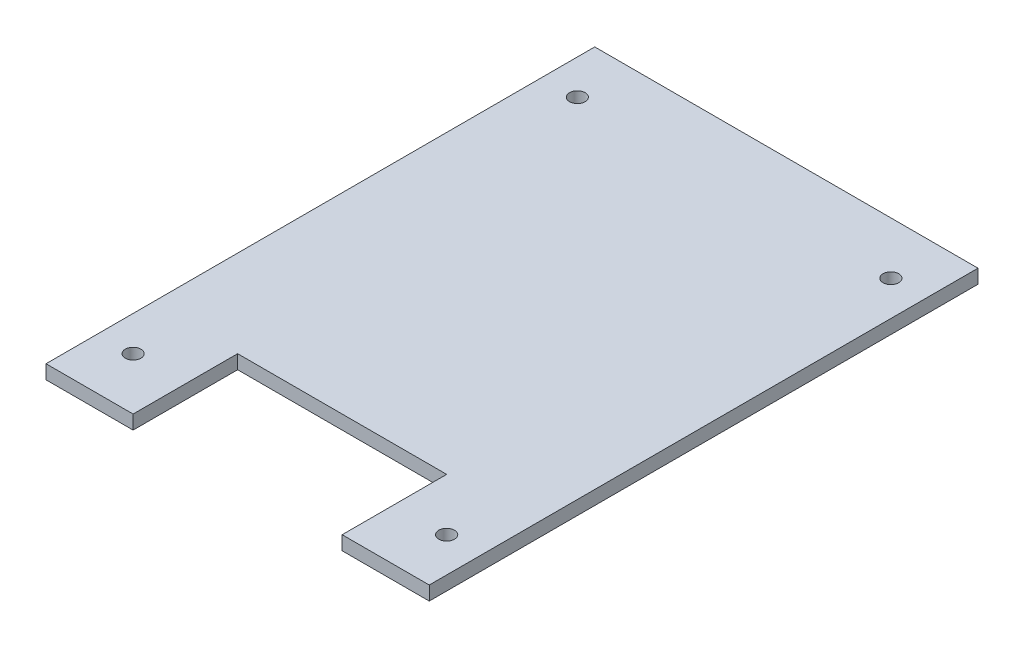
ISO-10303-21;
HEADER;
FILE_DESCRIPTION(('STEP AP214'),'2;1');
FILE_NAME('part.step','',(''),(''),'','','');
FILE_SCHEMA(('AUTOMOTIVE_DESIGN { 1 0 10303 214 1 1 1 1 }'));
ENDSEC;
DATA;
#1=APPLICATION_CONTEXT('core data for automotive mechanical design processes');
#2=APPLICATION_PROTOCOL_DEFINITION('international standard','automotive_design',2000,#1);
#3=PRODUCT_CONTEXT('',#1,'mechanical');
#4=PRODUCT('Part','Part','',(#3));
#5=PRODUCT_RELATED_PRODUCT_CATEGORY('part','',(#4));
#6=PRODUCT_DEFINITION_FORMATION('','',#4);
#7=PRODUCT_DEFINITION_CONTEXT('part definition',#1,'design');
#8=PRODUCT_DEFINITION('design','',#6,#7);
#9=PRODUCT_DEFINITION_SHAPE('','',#8);
#10=(LENGTH_UNIT() NAMED_UNIT(*) SI_UNIT(.MILLI.,.METRE.));
#11=(NAMED_UNIT(*) PLANE_ANGLE_UNIT() SI_UNIT($,.RADIAN.));
#12=(NAMED_UNIT(*) SI_UNIT($,.STERADIAN.) SOLID_ANGLE_UNIT());
#13=UNCERTAINTY_MEASURE_WITH_UNIT(LENGTH_MEASURE(1.E-05),#10,'distance_accuracy_value','');
#14=(GEOMETRIC_REPRESENTATION_CONTEXT(3) GLOBAL_UNCERTAINTY_ASSIGNED_CONTEXT((#13)) GLOBAL_UNIT_ASSIGNED_CONTEXT((#10,
#11,#12)) REPRESENTATION_CONTEXT('',''));
#15=CARTESIAN_POINT('',(0.,0.,0.));
#16=DIRECTION('',(0.,0.,1.));
#17=DIRECTION('',(1.,0.,0.));
#18=AXIS2_PLACEMENT_3D('',#15,#16,#17);
#19=CARTESIAN_POINT('',(0.,0.,0.));
#20=DIRECTION('',(0.,-1.,0.));
#21=DIRECTION('',(0.,0.,-1.));
#22=AXIS2_PLACEMENT_3D('',#19,#20,#21);
#23=PLANE('',#22);
#24=CARTESIAN_POINT('',(-45.,0.,-63.75));
#25=DIRECTION('',(0.,1.,0.));
#26=DIRECTION('',(0.,0.,1.));
#27=AXIS2_PLACEMENT_3D('',#24,#25,#26);
#28=CIRCLE('',#27,2.25);
#29=CARTESIAN_POINT('',(-45.,0.,-61.5));
#30=VERTEX_POINT('',#29);
#31=EDGE_CURVE('E197',#30,#30,#28,.T.);
#32=ORIENTED_EDGE('',*,*,#31,.T.);
#33=EDGE_LOOP('',(#32));
#34=FACE_BOUND('',#33,.T.);
#35=CARTESIAN_POINT('',(45.,0.,-63.75));
#36=DIRECTION('',(0.,1.,0.));
#37=DIRECTION('',(0.,0.,1.));
#38=AXIS2_PLACEMENT_3D('',#35,#36,#37);
#39=CIRCLE('',#38,2.25);
#40=CARTESIAN_POINT('',(45.,0.,-61.5));
#41=VERTEX_POINT('',#40);
#42=EDGE_CURVE('E191',#41,#41,#39,.T.);
#43=ORIENTED_EDGE('',*,*,#42,.T.);
#44=EDGE_LOOP('',(#43));
#45=FACE_BOUND('',#44,.T.);
#46=CARTESIAN_POINT('',(45.,0.,63.75));
#47=DIRECTION('',(0.,1.,0.));
#48=DIRECTION('',(0.,0.,1.));
#49=AXIS2_PLACEMENT_3D('',#46,#47,#48);
#50=CIRCLE('',#49,2.25);
#51=CARTESIAN_POINT('',(45.,0.,66.));
#52=VERTEX_POINT('',#51);
#53=EDGE_CURVE('E185',#52,#52,#50,.T.);
#54=ORIENTED_EDGE('',*,*,#53,.T.);
#55=EDGE_LOOP('',(#54));
#56=FACE_BOUND('',#55,.T.);
#57=DIRECTION('',(0.,0.,-1.));
#58=VECTOR('',#57,1.);
#59=CARTESIAN_POINT('',(55.,0.,78.75));
#60=LINE('',#59,#58);
#61=CARTESIAN_POINT('',(55.,0.,78.75));
#62=VERTEX_POINT('',#61);
#63=CARTESIAN_POINT('',(55.,0.,-78.75));
#64=VERTEX_POINT('',#63);
#65=EDGE_CURVE('E132',#62,#64,#60,.T.);
#66=ORIENTED_EDGE('',*,*,#65,.F.);
#67=DIRECTION('',(1.,0.,0.));
#68=VECTOR('',#67,1.);
#69=CARTESIAN_POINT('',(30.,0.,78.75));
#70=LINE('',#69,#68);
#71=CARTESIAN_POINT('',(30.,0.,78.75));
#72=VERTEX_POINT('',#71);
#73=EDGE_CURVE('E87',#72,#62,#70,.T.);
#74=ORIENTED_EDGE('',*,*,#73,.F.);
#75=DIRECTION('',(0.,0.,1.));
#76=VECTOR('',#75,1.);
#77=CARTESIAN_POINT('',(30.,0.,78.75));
#78=LINE('',#77,#76);
#79=CARTESIAN_POINT('',(30.,0.,48.75));
#80=VERTEX_POINT('',#79);
#81=EDGE_CURVE('E81',#80,#72,#78,.T.);
#82=ORIENTED_EDGE('',*,*,#81,.F.);
#83=DIRECTION('',(1.,0.,0.));
#84=VECTOR('',#83,1.);
#85=CARTESIAN_POINT('',(-30.,0.,48.75));
#86=LINE('',#85,#84);
#87=CARTESIAN_POINT('',(-30.,0.,48.75));
#88=VERTEX_POINT('',#87);
#89=EDGE_CURVE('E122',#88,#80,#86,.T.);
#90=ORIENTED_EDGE('',*,*,#89,.F.);
#91=DIRECTION('',(0.,0.,-1.));
#92=VECTOR('',#91,1.);
#93=CARTESIAN_POINT('',(-30.,0.,78.75));
#94=LINE('',#93,#92);
#95=CARTESIAN_POINT('',(-30.,0.,78.75));
#96=VERTEX_POINT('',#95);
#97=EDGE_CURVE('E142',#96,#88,#94,.T.);
#98=ORIENTED_EDGE('',*,*,#97,.F.);
#99=DIRECTION('',(1.,0.,0.));
#100=VECTOR('',#99,1.);
#101=CARTESIAN_POINT('',(-55.,0.,78.75));
#102=LINE('',#101,#100);
#103=CARTESIAN_POINT('',(-55.,0.,78.75));
#104=VERTEX_POINT('',#103);
#105=EDGE_CURVE('E140',#104,#96,#102,.T.);
#106=ORIENTED_EDGE('',*,*,#105,.F.);
#107=DIRECTION('',(0.,0.,1.));
#108=VECTOR('',#107,1.);
#109=CARTESIAN_POINT('',(-55.,0.,78.75));
#110=LINE('',#109,#108);
#111=CARTESIAN_POINT('',(-55.,0.,-78.75));
#112=VERTEX_POINT('',#111);
#113=EDGE_CURVE('E138',#112,#104,#110,.T.);
#114=ORIENTED_EDGE('',*,*,#113,.F.);
#115=DIRECTION('',(-1.,0.,0.));
#116=VECTOR('',#115,1.);
#117=CARTESIAN_POINT('',(-55.,0.,-78.75));
#118=LINE('',#117,#116);
#119=EDGE_CURVE('E135',#64,#112,#118,.T.);
#120=ORIENTED_EDGE('',*,*,#119,.F.);
#121=EDGE_LOOP('',(#66,#74,#82,#90,#98,#106,#114,#120));
#122=FACE_BOUND('',#121,.T.);
#123=CARTESIAN_POINT('',(-45.,0.,63.75));
#124=DIRECTION('',(0.,1.,0.));
#125=DIRECTION('',(0.,0.,1.));
#126=AXIS2_PLACEMENT_3D('',#123,#124,#125);
#127=CIRCLE('',#126,2.25);
#128=CARTESIAN_POINT('',(-45.,0.,66.));
#129=VERTEX_POINT('',#128);
#130=EDGE_CURVE('E136',#129,#129,#127,.T.);
#131=ORIENTED_EDGE('',*,*,#130,.T.);
#132=EDGE_LOOP('',(#131));
#133=FACE_BOUND('',#132,.T.);
#134=ADVANCED_FACE('F35',(#34,#45,#56,#122,#133),#23,.T.);
#135=CARTESIAN_POINT('',(55.,4.,78.75));
#136=DIRECTION('',(-1.,0.,0.));
#137=DIRECTION('',(0.,0.,1.));
#138=AXIS2_PLACEMENT_3D('',#135,#136,#137);
#139=PLANE('',#138);
#140=ORIENTED_EDGE('',*,*,#65,.T.);
#141=DIRECTION('',(0.,-1.,0.));
#142=VECTOR('',#141,1.);
#143=CARTESIAN_POINT('',(55.,4.,-78.75));
#144=LINE('',#143,#142);
#145=CARTESIAN_POINT('',(55.,4.,-78.75));
#146=VERTEX_POINT('',#145);
#147=EDGE_CURVE('E11',#146,#64,#144,.T.);
#148=ORIENTED_EDGE('',*,*,#147,.F.);
#149=DIRECTION('',(0.,0.,-1.));
#150=VECTOR('',#149,1.);
#151=CARTESIAN_POINT('',(55.,4.,78.75));
#152=LINE('',#151,#150);
#153=CARTESIAN_POINT('',(55.,4.,78.75));
#154=VERTEX_POINT('',#153);
#155=EDGE_CURVE('E147',#154,#146,#152,.T.);
#156=ORIENTED_EDGE('',*,*,#155,.F.);
#157=DIRECTION('',(0.,-1.,0.));
#158=VECTOR('',#157,1.);
#159=CARTESIAN_POINT('',(55.,4.,78.75));
#160=LINE('',#159,#158);
#161=EDGE_CURVE('E128',#154,#62,#160,.T.);
#162=ORIENTED_EDGE('',*,*,#161,.T.);
#163=EDGE_LOOP('',(#140,#148,#156,#162));
#164=FACE_BOUND('',#163,.T.);
#165=ADVANCED_FACE('F37',(#164),#139,.F.);
#166=CARTESIAN_POINT('',(-55.,4.,-78.75));
#167=DIRECTION('',(0.,0.,1.));
#168=DIRECTION('',(1.,0.,0.));
#169=AXIS2_PLACEMENT_3D('',#166,#167,#168);
#170=PLANE('',#169);
#171=ORIENTED_EDGE('',*,*,#119,.T.);
#172=DIRECTION('',(0.,-1.,0.));
#173=VECTOR('',#172,1.);
#174=CARTESIAN_POINT('',(-55.,4.,-78.75));
#175=LINE('',#174,#173);
#176=CARTESIAN_POINT('',(-55.,4.,-78.75));
#177=VERTEX_POINT('',#176);
#178=EDGE_CURVE('E44',#177,#112,#175,.T.);
#179=ORIENTED_EDGE('',*,*,#178,.F.);
#180=DIRECTION('',(-1.,0.,0.));
#181=VECTOR('',#180,1.);
#182=CARTESIAN_POINT('',(-55.,4.,-78.75));
#183=LINE('',#182,#181);
#184=EDGE_CURVE('E95',#146,#177,#183,.T.);
#185=ORIENTED_EDGE('',*,*,#184,.F.);
#186=ORIENTED_EDGE('',*,*,#147,.T.);
#187=EDGE_LOOP('',(#171,#179,#185,#186));
#188=FACE_BOUND('',#187,.T.);
#189=ADVANCED_FACE('F234',(#188),#170,.F.);
#190=CARTESIAN_POINT('',(-55.,4.,78.75));
#191=DIRECTION('',(1.,0.,0.));
#192=DIRECTION('',(0.,0.,-1.));
#193=AXIS2_PLACEMENT_3D('',#190,#191,#192);
#194=PLANE('',#193);
#195=ORIENTED_EDGE('',*,*,#113,.T.);
#196=DIRECTION('',(0.,-1.,0.));
#197=VECTOR('',#196,1.);
#198=CARTESIAN_POINT('',(-55.,4.,78.75));
#199=LINE('',#198,#197);
#200=CARTESIAN_POINT('',(-55.,4.,78.75));
#201=VERTEX_POINT('',#200);
#202=EDGE_CURVE('E154',#201,#104,#199,.T.);
#203=ORIENTED_EDGE('',*,*,#202,.F.);
#204=DIRECTION('',(0.,0.,1.));
#205=VECTOR('',#204,1.);
#206=CARTESIAN_POINT('',(-55.,4.,78.75));
#207=LINE('',#206,#205);
#208=EDGE_CURVE('E162',#177,#201,#207,.T.);
#209=ORIENTED_EDGE('',*,*,#208,.F.);
#210=ORIENTED_EDGE('',*,*,#178,.T.);
#211=EDGE_LOOP('',(#195,#203,#209,#210));
#212=FACE_BOUND('',#211,.T.);
#213=ADVANCED_FACE('F160',(#212),#194,.F.);
#214=CARTESIAN_POINT('',(-55.,4.,78.75));
#215=DIRECTION('',(0.,0.,-1.));
#216=DIRECTION('',(-1.,0.,0.));
#217=AXIS2_PLACEMENT_3D('',#214,#215,#216);
#218=PLANE('',#217);
#219=ORIENTED_EDGE('',*,*,#105,.T.);
#220=DIRECTION('',(0.,-1.,0.));
#221=VECTOR('',#220,1.);
#222=CARTESIAN_POINT('',(-30.,4.,78.75));
#223=LINE('',#222,#221);
#224=CARTESIAN_POINT('',(-30.,4.,78.75));
#225=VERTEX_POINT('',#224);
#226=EDGE_CURVE('E151',#225,#96,#223,.T.);
#227=ORIENTED_EDGE('',*,*,#226,.F.);
#228=DIRECTION('',(1.,0.,0.));
#229=VECTOR('',#228,1.);
#230=CARTESIAN_POINT('',(-55.,4.,78.75));
#231=LINE('',#230,#229);
#232=EDGE_CURVE('E174',#201,#225,#231,.T.);
#233=ORIENTED_EDGE('',*,*,#232,.F.);
#234=ORIENTED_EDGE('',*,*,#202,.T.);
#235=EDGE_LOOP('',(#219,#227,#233,#234));
#236=FACE_BOUND('',#235,.T.);
#237=ADVANCED_FACE('F170',(#236),#218,.F.);
#238=CARTESIAN_POINT('',(-30.,4.,78.75));
#239=DIRECTION('',(-1.,0.,0.));
#240=DIRECTION('',(0.,0.,1.));
#241=AXIS2_PLACEMENT_3D('',#238,#239,#240);
#242=PLANE('',#241);
#243=ORIENTED_EDGE('',*,*,#97,.T.);
#244=DIRECTION('',(0.,-1.,0.));
#245=VECTOR('',#244,1.);
#246=CARTESIAN_POINT('',(-30.,4.,48.75));
#247=LINE('',#246,#245);
#248=CARTESIAN_POINT('',(-30.,4.,48.75));
#249=VERTEX_POINT('',#248);
#250=EDGE_CURVE('E123',#249,#88,#247,.T.);
#251=ORIENTED_EDGE('',*,*,#250,.F.);
#252=DIRECTION('',(0.,0.,-1.));
#253=VECTOR('',#252,1.);
#254=CARTESIAN_POINT('',(-30.,4.,78.75));
#255=LINE('',#254,#253);
#256=EDGE_CURVE('E114',#225,#249,#255,.T.);
#257=ORIENTED_EDGE('',*,*,#256,.F.);
#258=ORIENTED_EDGE('',*,*,#226,.T.);
#259=EDGE_LOOP('',(#243,#251,#257,#258));
#260=FACE_BOUND('',#259,.T.);
#261=ADVANCED_FACE('F173',(#260),#242,.F.);
#262=CARTESIAN_POINT('',(-30.,4.,48.75));
#263=DIRECTION('',(0.,0.,-1.));
#264=DIRECTION('',(-1.,0.,0.));
#265=AXIS2_PLACEMENT_3D('',#262,#263,#264);
#266=PLANE('',#265);
#267=ORIENTED_EDGE('',*,*,#89,.T.);
#268=DIRECTION('',(0.,-1.,0.));
#269=VECTOR('',#268,1.);
#270=CARTESIAN_POINT('',(30.,4.,48.75));
#271=LINE('',#270,#269);
#272=CARTESIAN_POINT('',(30.,4.,48.75));
#273=VERTEX_POINT('',#272);
#274=EDGE_CURVE('E119',#273,#80,#271,.T.);
#275=ORIENTED_EDGE('',*,*,#274,.F.);
#276=DIRECTION('',(1.,0.,0.));
#277=VECTOR('',#276,1.);
#278=CARTESIAN_POINT('',(-30.,4.,48.75));
#279=LINE('',#278,#277);
#280=EDGE_CURVE('E108',#249,#273,#279,.T.);
#281=ORIENTED_EDGE('',*,*,#280,.F.);
#282=ORIENTED_EDGE('',*,*,#250,.T.);
#283=EDGE_LOOP('',(#267,#275,#281,#282));
#284=FACE_BOUND('',#283,.T.);
#285=ADVANCED_FACE('F120',(#284),#266,.F.);
#286=CARTESIAN_POINT('',(30.,4.,78.75));
#287=DIRECTION('',(1.,0.,0.));
#288=DIRECTION('',(0.,0.,-1.));
#289=AXIS2_PLACEMENT_3D('',#286,#287,#288);
#290=PLANE('',#289);
#291=ORIENTED_EDGE('',*,*,#81,.T.);
#292=DIRECTION('',(0.,-1.,0.));
#293=VECTOR('',#292,1.);
#294=CARTESIAN_POINT('',(30.,4.,78.75));
#295=LINE('',#294,#293);
#296=CARTESIAN_POINT('',(30.,4.,78.75));
#297=VERTEX_POINT('',#296);
#298=EDGE_CURVE('E124',#297,#72,#295,.T.);
#299=ORIENTED_EDGE('',*,*,#298,.F.);
#300=DIRECTION('',(0.,0.,1.));
#301=VECTOR('',#300,1.);
#302=CARTESIAN_POINT('',(30.,4.,78.75));
#303=LINE('',#302,#301);
#304=EDGE_CURVE('E112',#273,#297,#303,.T.);
#305=ORIENTED_EDGE('',*,*,#304,.F.);
#306=ORIENTED_EDGE('',*,*,#274,.T.);
#307=EDGE_LOOP('',(#291,#299,#305,#306));
#308=FACE_BOUND('',#307,.T.);
#309=ADVANCED_FACE('F126',(#308),#290,.F.);
#310=CARTESIAN_POINT('',(30.,4.,78.75));
#311=DIRECTION('',(0.,0.,-1.));
#312=DIRECTION('',(-1.,0.,0.));
#313=AXIS2_PLACEMENT_3D('',#310,#311,#312);
#314=PLANE('',#313);
#315=ORIENTED_EDGE('',*,*,#73,.T.);
#316=ORIENTED_EDGE('',*,*,#161,.F.);
#317=DIRECTION('',(1.,0.,0.));
#318=VECTOR('',#317,1.);
#319=CARTESIAN_POINT('',(30.,4.,78.75));
#320=LINE('',#319,#318);
#321=EDGE_CURVE('E52',#297,#154,#320,.T.);
#322=ORIENTED_EDGE('',*,*,#321,.F.);
#323=ORIENTED_EDGE('',*,*,#298,.T.);
#324=EDGE_LOOP('',(#315,#316,#322,#323));
#325=FACE_BOUND('',#324,.T.);
#326=ADVANCED_FACE('F209',(#325),#314,.F.);
#327=CARTESIAN_POINT('',(0.,4.,0.));
#328=DIRECTION('',(0.,-1.,0.));
#329=DIRECTION('',(0.,0.,-1.));
#330=AXIS2_PLACEMENT_3D('',#327,#328,#329);
#331=PLANE('',#330);
#332=CARTESIAN_POINT('',(-45.,4.,-63.75));
#333=DIRECTION('',(0.,1.,0.));
#334=DIRECTION('',(0.,0.,1.));
#335=AXIS2_PLACEMENT_3D('',#332,#333,#334);
#336=CIRCLE('',#335,2.25);
#337=CARTESIAN_POINT('',(-45.,4.,-61.5));
#338=VERTEX_POINT('',#337);
#339=EDGE_CURVE('E200',#338,#338,#336,.T.);
#340=ORIENTED_EDGE('',*,*,#339,.F.);
#341=EDGE_LOOP('',(#340));
#342=FACE_BOUND('',#341,.T.);
#343=CARTESIAN_POINT('',(45.,4.,-63.75));
#344=DIRECTION('',(0.,1.,0.));
#345=DIRECTION('',(0.,0.,1.));
#346=AXIS2_PLACEMENT_3D('',#343,#344,#345);
#347=CIRCLE('',#346,2.25);
#348=CARTESIAN_POINT('',(45.,4.,-61.5));
#349=VERTEX_POINT('',#348);
#350=EDGE_CURVE('E194',#349,#349,#347,.T.);
#351=ORIENTED_EDGE('',*,*,#350,.F.);
#352=EDGE_LOOP('',(#351));
#353=FACE_BOUND('',#352,.T.);
#354=CARTESIAN_POINT('',(45.,4.,63.75));
#355=DIRECTION('',(0.,1.,0.));
#356=DIRECTION('',(0.,0.,1.));
#357=AXIS2_PLACEMENT_3D('',#354,#355,#356);
#358=CIRCLE('',#357,2.25);
#359=CARTESIAN_POINT('',(45.,4.,66.));
#360=VERTEX_POINT('',#359);
#361=EDGE_CURVE('E188',#360,#360,#358,.T.);
#362=ORIENTED_EDGE('',*,*,#361,.F.);
#363=EDGE_LOOP('',(#362));
#364=FACE_BOUND('',#363,.T.);
#365=CARTESIAN_POINT('',(-45.,4.,63.75));
#366=DIRECTION('',(0.,1.,0.));
#367=DIRECTION('',(0.,0.,1.));
#368=AXIS2_PLACEMENT_3D('',#365,#366,#367);
#369=CIRCLE('',#368,2.25);
#370=CARTESIAN_POINT('',(-45.,4.,66.));
#371=VERTEX_POINT('',#370);
#372=EDGE_CURVE('E182',#371,#371,#369,.T.);
#373=ORIENTED_EDGE('',*,*,#372,.F.);
#374=EDGE_LOOP('',(#373));
#375=FACE_BOUND('',#374,.T.);
#376=ORIENTED_EDGE('',*,*,#155,.T.);
#377=ORIENTED_EDGE('',*,*,#184,.T.);
#378=ORIENTED_EDGE('',*,*,#208,.T.);
#379=ORIENTED_EDGE('',*,*,#232,.T.);
#380=ORIENTED_EDGE('',*,*,#256,.T.);
#381=ORIENTED_EDGE('',*,*,#280,.T.);
#382=ORIENTED_EDGE('',*,*,#304,.T.);
#383=ORIENTED_EDGE('',*,*,#321,.T.);
#384=EDGE_LOOP('',(#376,#377,#378,#379,#380,#381,#382,#383));
#385=FACE_BOUND('',#384,.T.);
#386=ADVANCED_FACE('F110',(#342,#353,#364,#375,#385),#331,.F.);
#387=CARTESIAN_POINT('',(-45.,4.,63.75));
#388=DIRECTION('',(0.,1.,0.));
#389=DIRECTION('',(0.,0.,1.));
#390=AXIS2_PLACEMENT_3D('',#387,#388,#389);
#391=CYLINDRICAL_SURFACE('',#390,2.25);
#392=ORIENTED_EDGE('',*,*,#130,.F.);
#393=EDGE_LOOP('',(#392));
#394=FACE_BOUND('',#393,.T.);
#395=ORIENTED_EDGE('',*,*,#372,.T.);
#396=EDGE_LOOP('',(#395));
#397=FACE_BOUND('',#396,.T.);
#398=ADVANCED_FACE('F208',(#394,#397),#391,.F.);
#399=CARTESIAN_POINT('',(45.,4.,63.75));
#400=DIRECTION('',(0.,1.,0.));
#401=DIRECTION('',(0.,0.,1.));
#402=AXIS2_PLACEMENT_3D('',#399,#400,#401);
#403=CYLINDRICAL_SURFACE('',#402,2.25);
#404=ORIENTED_EDGE('',*,*,#53,.F.);
#405=EDGE_LOOP('',(#404));
#406=FACE_BOUND('',#405,.T.);
#407=ORIENTED_EDGE('',*,*,#361,.T.);
#408=EDGE_LOOP('',(#407));
#409=FACE_BOUND('',#408,.T.);
#410=ADVANCED_FACE('F218',(#406,#409),#403,.F.);
#411=CARTESIAN_POINT('',(45.,4.,-63.75));
#412=DIRECTION('',(0.,1.,0.));
#413=DIRECTION('',(0.,0.,1.));
#414=AXIS2_PLACEMENT_3D('',#411,#412,#413);
#415=CYLINDRICAL_SURFACE('',#414,2.25);
#416=ORIENTED_EDGE('',*,*,#42,.F.);
#417=EDGE_LOOP('',(#416));
#418=FACE_BOUND('',#417,.T.);
#419=ORIENTED_EDGE('',*,*,#350,.T.);
#420=EDGE_LOOP('',(#419));
#421=FACE_BOUND('',#420,.T.);
#422=ADVANCED_FACE('F224',(#418,#421),#415,.F.);
#423=CARTESIAN_POINT('',(-45.,4.,-63.75));
#424=DIRECTION('',(0.,1.,0.));
#425=DIRECTION('',(0.,0.,1.));
#426=AXIS2_PLACEMENT_3D('',#423,#424,#425);
#427=CYLINDRICAL_SURFACE('',#426,2.25);
#428=ORIENTED_EDGE('',*,*,#31,.F.);
#429=EDGE_LOOP('',(#428));
#430=FACE_BOUND('',#429,.T.);
#431=ORIENTED_EDGE('',*,*,#339,.T.);
#432=EDGE_LOOP('',(#431));
#433=FACE_BOUND('',#432,.T.);
#434=ADVANCED_FACE('F204',(#430,#433),#427,.F.);
#435=CLOSED_SHELL('',(#134,#165,#189,#213,#237,#261,#285,#309,#326,#386,#398,#410,#422,#434));
#436=MANIFOLD_SOLID_BREP('B2',#435);
#437=ADVANCED_BREP_SHAPE_REPRESENTATION('',(#18,#436),#14);
#438=SHAPE_DEFINITION_REPRESENTATION(#9,#437);
ENDSEC;
END-ISO-10303-21;
